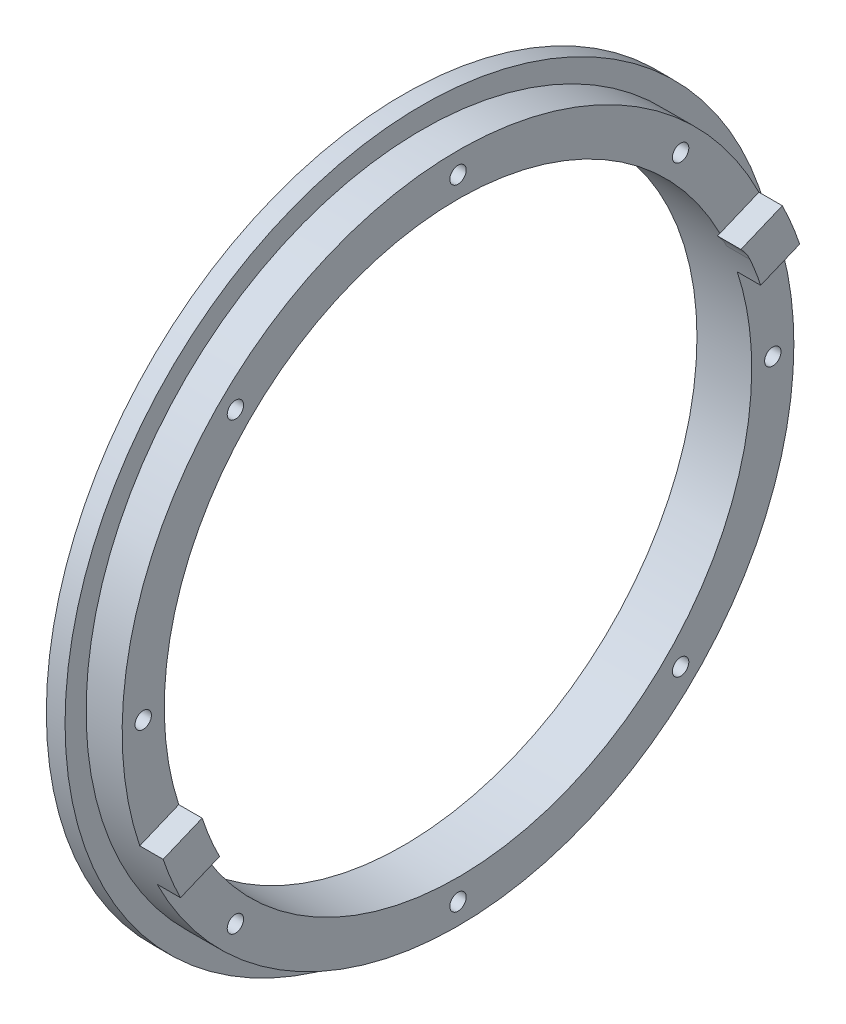
ISO-10303-21;
HEADER;
FILE_DESCRIPTION(('STEP AP214'),'2;1');
FILE_NAME('part.step','',(''),(''),'','','');
FILE_SCHEMA(('AUTOMOTIVE_DESIGN { 1 0 10303 214 1 1 1 1 }'));
ENDSEC;
DATA;
#1=APPLICATION_CONTEXT('core data for automotive mechanical design processes');
#2=APPLICATION_PROTOCOL_DEFINITION('international standard','automotive_design',2000,#1);
#3=PRODUCT_CONTEXT('',#1,'mechanical');
#4=PRODUCT('Part','Part','',(#3));
#5=PRODUCT_RELATED_PRODUCT_CATEGORY('part','',(#4));
#6=PRODUCT_DEFINITION_FORMATION('','',#4);
#7=PRODUCT_DEFINITION_CONTEXT('part definition',#1,'design');
#8=PRODUCT_DEFINITION('design','',#6,#7);
#9=PRODUCT_DEFINITION_SHAPE('','',#8);
#10=(LENGTH_UNIT() NAMED_UNIT(*) SI_UNIT(.MILLI.,.METRE.));
#11=(NAMED_UNIT(*) PLANE_ANGLE_UNIT() SI_UNIT($,.RADIAN.));
#12=(NAMED_UNIT(*) SI_UNIT($,.STERADIAN.) SOLID_ANGLE_UNIT());
#13=UNCERTAINTY_MEASURE_WITH_UNIT(LENGTH_MEASURE(1.E-05),#10,'distance_accuracy_value','');
#14=(GEOMETRIC_REPRESENTATION_CONTEXT(3) GLOBAL_UNCERTAINTY_ASSIGNED_CONTEXT((#13)) GLOBAL_UNIT_ASSIGNED_CONTEXT((#10,
#11,#12)) REPRESENTATION_CONTEXT('',''));
#15=CARTESIAN_POINT('',(0.,0.,0.));
#16=DIRECTION('',(0.,0.,1.));
#17=DIRECTION('',(1.,0.,0.));
#18=AXIS2_PLACEMENT_3D('',#15,#16,#17);
#19=CARTESIAN_POINT('',(-30.3,62.75,0.));
#20=DIRECTION('',(1.,0.,0.));
#21=DIRECTION('',(0.,0.,-1.));
#22=AXIS2_PLACEMENT_3D('',#19,#20,#21);
#23=PLANE('',#22);
#24=DIRECTION('',(0.,-0.382683432364652,0.923879532511468));
#25=VECTOR('',#24,1.);
#26=CARTESIAN_POINT('',(-30.3,22.9139193047166,-67.9927555118701));
#27=LINE('',#26,#25);
#28=CARTESIAN_POINT('',(-30.3,22.9139193047166,-67.9927555118701));
#29=VERTEX_POINT('',#28);
#30=CARTESIAN_POINT('',(-30.3,19.4607357434147,-59.6560329248));
#31=VERTEX_POINT('',#30);
#32=EDGE_CURVE('E147',#29,#31,#27,.T.);
#33=ORIENTED_EDGE('',*,*,#32,.F.);
#34=CARTESIAN_POINT('',(-30.3,0.,0.));
#35=DIRECTION('',(1.,0.,0.));
#36=DIRECTION('',(0.,0.,-1.));
#37=AXIS2_PLACEMENT_3D('',#34,#35,#36);
#38=CIRCLE('',#37,71.75);
#39=CARTESIAN_POINT('',(-30.3,31.875550770089,-64.2807262179283));
#40=VERTEX_POINT('',#39);
#41=EDGE_CURVE('E43',#29,#40,#38,.T.);
#42=ORIENTED_EDGE('',*,*,#41,.T.);
#43=DIRECTION('',(0.,0.382683432366034,-0.923879532510895));
#44=VECTOR('',#43,1.);
#45=CARTESIAN_POINT('',(-30.3,28.4223672087732,-55.94400363086));
#46=LINE('',#45,#44);
#47=CARTESIAN_POINT('',(-30.3,28.21016806619,-55.43170958291));
#48=VERTEX_POINT('',#47);
#49=EDGE_CURVE('E158',#48,#40,#46,.T.);
#50=ORIENTED_EDGE('',*,*,#49,.F.);
#51=CARTESIAN_POINT('',(-30.3,21.5977855693646,-48.8921073231567));
#52=DIRECTION('',(-1.,0.,0.));
#53=DIRECTION('',(0.,0.,1.));
#54=AXIS2_PLACEMENT_3D('',#51,#52,#53);
#55=CIRCLE('',#54,9.30000000000502);
#56=CARTESIAN_POINT('',(-30.3,25.3556790360666,-57.3990595795769));
#57=VERTEX_POINT('',#56);
#58=EDGE_CURVE('E130',#48,#57,#55,.T.);
#59=ORIENTED_EDGE('',*,*,#58,.T.);
#60=CARTESIAN_POINT('',(-30.3,0.,0.));
#61=DIRECTION('',(1.,0.,0.));
#62=DIRECTION('',(0.,0.,-1.));
#63=AXIS2_PLACEMENT_3D('',#60,#61,#62);
#64=CIRCLE('',#63,62.75);
#65=EDGE_CURVE('E137',#31,#57,#64,.T.);
#66=ORIENTED_EDGE('',*,*,#65,.F.);
#67=EDGE_LOOP('',(#33,#42,#50,#59,#66));
#68=FACE_BOUND('',#67,.T.);
#69=ADVANCED_FACE('F34',(#68),#23,.T.);
#70=DIRECTION('',(0.,-0.382683432365399,0.923879532511159));
#71=VECTOR('',#70,1.);
#72=CARTESIAN_POINT('',(-30.3,-28.42236720877,55.94400363086));
#73=LINE('',#72,#71);
#74=CARTESIAN_POINT('',(-30.3,-28.42236720877,55.94400363086));
#75=VERTEX_POINT('',#74);
#76=CARTESIAN_POINT('',(-30.3,-31.8755507700787,64.2807262179274));
#77=VERTEX_POINT('',#76);
#78=EDGE_CURVE('E139',#75,#77,#73,.T.);
#79=ORIENTED_EDGE('',*,*,#78,.F.);
#80=CARTESIAN_POINT('',(-30.3,-19.4607357434007,59.6560329248));
#81=VERTEX_POINT('',#80);
#82=EDGE_CURVE('E185',#81,#75,#64,.T.);
#83=ORIENTED_EDGE('',*,*,#82,.F.);
#84=DIRECTION('',(0.,0.382683432365862,-0.923879532510967));
#85=VECTOR('',#84,1.);
#86=CARTESIAN_POINT('',(-30.3,-22.9139193047154,67.99275551187));
#87=LINE('',#86,#85);
#88=CARTESIAN_POINT('',(-30.3,-22.9139193047154,67.99275551187));
#89=VERTEX_POINT('',#88);
#90=EDGE_CURVE('E168',#89,#81,#87,.T.);
#91=ORIENTED_EDGE('',*,*,#90,.F.);
#92=EDGE_CURVE('E11',#89,#77,#38,.T.);
#93=ORIENTED_EDGE('',*,*,#92,.T.);
#94=EDGE_LOOP('',(#79,#83,#91,#93));
#95=FACE_BOUND('',#94,.T.);
#96=ADVANCED_FACE('F36',(#95),#23,.T.);
#97=CARTESIAN_POINT('',(-47.,0.,0.));
#98=DIRECTION('',(1.,0.,0.));
#99=DIRECTION('',(0.,0.,-1.));
#100=AXIS2_PLACEMENT_3D('',#97,#98,#99);
#101=CYLINDRICAL_SURFACE('',#100,71.75);
#102=DIRECTION('',(1.,0.,0.));
#103=VECTOR('',#102,1.);
#104=CARTESIAN_POINT('',(-35.3,22.9139193047166,-67.9927555118701));
#105=LINE('',#104,#103);
#106=CARTESIAN_POINT('',(-35.3,22.9139193047166,-67.9927555118701));
#107=VERTEX_POINT('',#106);
#108=EDGE_CURVE('E159',#107,#29,#105,.T.);
#109=ORIENTED_EDGE('',*,*,#108,.F.);
#110=CARTESIAN_POINT('',(-35.3,0.,0.));
#111=DIRECTION('',(1.,0.,0.));
#112=DIRECTION('',(0.,0.,-1.));
#113=AXIS2_PLACEMENT_3D('',#110,#111,#112);
#114=CIRCLE('',#113,71.75);
#115=CARTESIAN_POINT('',(-35.3,-31.8755507700787,64.2807262179274));
#116=VERTEX_POINT('',#115);
#117=EDGE_CURVE('E150',#116,#107,#114,.T.);
#118=ORIENTED_EDGE('',*,*,#117,.F.);
#119=DIRECTION('',(1.,0.,0.));
#120=VECTOR('',#119,1.);
#121=CARTESIAN_POINT('',(-35.3,-31.8755507700787,64.2807262179274));
#122=LINE('',#121,#120);
#123=EDGE_CURVE('E161',#116,#77,#122,.T.);
#124=ORIENTED_EDGE('',*,*,#123,.T.);
#125=ORIENTED_EDGE('',*,*,#92,.F.);
#126=DIRECTION('',(1.,0.,0.));
#127=VECTOR('',#126,1.);
#128=CARTESIAN_POINT('',(-35.3,-22.9139193047154,67.99275551187));
#129=LINE('',#128,#127);
#130=CARTESIAN_POINT('',(-35.3,-22.9139193047154,67.99275551187));
#131=VERTEX_POINT('',#130);
#132=EDGE_CURVE('E181',#131,#89,#129,.T.);
#133=ORIENTED_EDGE('',*,*,#132,.F.);
#134=CARTESIAN_POINT('',(-35.3,1.32185928869433E-12,-2.60208521396521E-12));
#135=DIRECTION('',(1.,0.,0.));
#136=DIRECTION('',(0.,0.,-1.));
#137=AXIS2_PLACEMENT_3D('',#134,#135,#136);
#138=CIRCLE('',#137,71.7500000000025);
#139=CARTESIAN_POINT('',(-35.3,31.875550770089,-64.2807262179283));
#140=VERTEX_POINT('',#139);
#141=EDGE_CURVE('E171',#140,#131,#138,.T.);
#142=ORIENTED_EDGE('',*,*,#141,.F.);
#143=DIRECTION('',(1.,0.,0.));
#144=VECTOR('',#143,1.);
#145=CARTESIAN_POINT('',(-35.3,31.875550770089,-64.2807262179283));
#146=LINE('',#145,#144);
#147=EDGE_CURVE('E174',#140,#40,#146,.T.);
#148=ORIENTED_EDGE('',*,*,#147,.T.);
#149=ORIENTED_EDGE('',*,*,#41,.F.);
#150=EDGE_LOOP('',(#109,#118,#124,#125,#133,#142,#148,#149));
#151=FACE_BOUND('',#150,.T.);
#152=CARTESIAN_POINT('',(-43.,0.,0.));
#153=DIRECTION('',(1.,0.,0.));
#154=DIRECTION('',(0.,0.,-1.));
#155=AXIS2_PLACEMENT_3D('',#152,#153,#154);
#156=CIRCLE('',#155,71.75);
#157=CARTESIAN_POINT('',(-43.,0.,-71.75));
#158=VERTEX_POINT('',#157);
#159=EDGE_CURVE('E197',#158,#158,#156,.T.);
#160=ORIENTED_EDGE('',*,*,#159,.T.);
#161=EDGE_LOOP('',(#160));
#162=FACE_BOUND('',#161,.T.);
#163=ADVANCED_FACE('F304',(#151,#162),#101,.T.);
#164=CARTESIAN_POINT('',(-43.,71.75,0.));
#165=DIRECTION('',(1.,0.,0.));
#166=DIRECTION('',(0.,0.,-1.));
#167=AXIS2_PLACEMENT_3D('',#164,#165,#166);
#168=PLANE('',#167);
#169=CARTESIAN_POINT('',(-43.,0.,0.));
#170=DIRECTION('',(1.,0.,0.));
#171=DIRECTION('',(0.,0.,-1.));
#172=AXIS2_PLACEMENT_3D('',#169,#170,#171);
#173=CIRCLE('',#172,76.25);
#174=CARTESIAN_POINT('',(-43.,0.,-76.25));
#175=VERTEX_POINT('',#174);
#176=EDGE_CURVE('E194',#175,#175,#173,.T.);
#177=ORIENTED_EDGE('',*,*,#176,.T.);
#178=EDGE_LOOP('',(#177));
#179=FACE_BOUND('',#178,.T.);
#180=ORIENTED_EDGE('',*,*,#159,.F.);
#181=EDGE_LOOP('',(#180));
#182=FACE_BOUND('',#181,.T.);
#183=ADVANCED_FACE('F329',(#179,#182),#168,.T.);
#184=CARTESIAN_POINT('',(-47.,0.,0.));
#185=DIRECTION('',(1.,0.,0.));
#186=DIRECTION('',(0.,0.,-1.));
#187=AXIS2_PLACEMENT_3D('',#184,#185,#186);
#188=CYLINDRICAL_SURFACE('',#187,76.25);
#189=CARTESIAN_POINT('',(-47.,0.,0.));
#190=DIRECTION('',(1.,0.,0.));
#191=DIRECTION('',(0.,0.,-1.));
#192=AXIS2_PLACEMENT_3D('',#189,#190,#191);
#193=CIRCLE('',#192,76.25);
#194=CARTESIAN_POINT('',(-47.,0.,-76.25));
#195=VERTEX_POINT('',#194);
#196=EDGE_CURVE('E191',#195,#195,#193,.T.);
#197=ORIENTED_EDGE('',*,*,#196,.T.);
#198=EDGE_LOOP('',(#197));
#199=FACE_BOUND('',#198,.T.);
#200=ORIENTED_EDGE('',*,*,#176,.F.);
#201=EDGE_LOOP('',(#200));
#202=FACE_BOUND('',#201,.T.);
#203=ADVANCED_FACE('F333',(#199,#202),#188,.T.);
#204=CARTESIAN_POINT('',(-47.,76.25,0.));
#205=DIRECTION('',(-1.,0.,0.));
#206=DIRECTION('',(0.,0.,1.));
#207=AXIS2_PLACEMENT_3D('',#204,#205,#206);
#208=PLANE('',#207);
#209=CARTESIAN_POINT('',(-47.,-47.5529310348,-47.5529310348));
#210=DIRECTION('',(-1.,0.,0.));
#211=DIRECTION('',(0.,0.,1.));
#212=AXIS2_PLACEMENT_3D('',#209,#210,#211);
#213=CIRCLE('',#212,3.25000000000002);
#214=CARTESIAN_POINT('',(-47.,-47.5529310348,-44.3029310348));
#215=VERTEX_POINT('',#214);
#216=EDGE_CURVE('E347',#215,#215,#213,.T.);
#217=ORIENTED_EDGE('',*,*,#216,.F.);
#218=EDGE_LOOP('',(#217));
#219=FACE_BOUND('',#218,.T.);
#220=CARTESIAN_POINT('',(-47.,-67.25,0.));
#221=DIRECTION('',(-1.,0.,0.));
#222=DIRECTION('',(0.,0.,1.));
#223=AXIS2_PLACEMENT_3D('',#220,#221,#222);
#224=CIRCLE('',#223,3.25000000000002);
#225=CARTESIAN_POINT('',(-47.,-67.25,3.25000000000002));
#226=VERTEX_POINT('',#225);
#227=EDGE_CURVE('E243',#226,#226,#224,.T.);
#228=ORIENTED_EDGE('',*,*,#227,.F.);
#229=EDGE_LOOP('',(#228));
#230=FACE_BOUND('',#229,.T.);
#231=CARTESIAN_POINT('',(-47.,-47.5529310348,47.5529310348));
#232=DIRECTION('',(-1.,0.,0.));
#233=DIRECTION('',(0.,0.,1.));
#234=AXIS2_PLACEMENT_3D('',#231,#232,#233);
#235=CIRCLE('',#234,3.25000000000002);
#236=CARTESIAN_POINT('',(-47.,-47.5529310348,50.8029310348));
#237=VERTEX_POINT('',#236);
#238=EDGE_CURVE('E230',#237,#237,#235,.T.);
#239=ORIENTED_EDGE('',*,*,#238,.F.);
#240=EDGE_LOOP('',(#239));
#241=FACE_BOUND('',#240,.T.);
#242=CARTESIAN_POINT('',(-47.,0.,67.25));
#243=DIRECTION('',(-1.,0.,0.));
#244=DIRECTION('',(0.,0.,1.));
#245=AXIS2_PLACEMENT_3D('',#242,#243,#244);
#246=CIRCLE('',#245,3.25000000000001);
#247=CARTESIAN_POINT('',(-47.,0.,70.5));
#248=VERTEX_POINT('',#247);
#249=EDGE_CURVE('E226',#248,#248,#246,.T.);
#250=ORIENTED_EDGE('',*,*,#249,.F.);
#251=EDGE_LOOP('',(#250));
#252=FACE_BOUND('',#251,.T.);
#253=CARTESIAN_POINT('',(-47.,47.5529310348,47.5529310348));
#254=DIRECTION('',(-1.,0.,0.));
#255=DIRECTION('',(0.,0.,1.));
#256=AXIS2_PLACEMENT_3D('',#253,#254,#255);
#257=CIRCLE('',#256,3.25000000000002);
#258=CARTESIAN_POINT('',(-47.,47.5529310348,50.8029310348));
#259=VERTEX_POINT('',#258);
#260=EDGE_CURVE('E222',#259,#259,#257,.T.);
#261=ORIENTED_EDGE('',*,*,#260,.F.);
#262=EDGE_LOOP('',(#261));
#263=FACE_BOUND('',#262,.T.);
#264=CARTESIAN_POINT('',(-47.,67.25,0.));
#265=DIRECTION('',(-1.,0.,0.));
#266=DIRECTION('',(0.,0.,1.));
#267=AXIS2_PLACEMENT_3D('',#264,#265,#266);
#268=CIRCLE('',#267,3.25000000000002);
#269=CARTESIAN_POINT('',(-47.,67.25,3.25000000000002));
#270=VERTEX_POINT('',#269);
#271=EDGE_CURVE('E217',#270,#270,#268,.T.);
#272=ORIENTED_EDGE('',*,*,#271,.F.);
#273=EDGE_LOOP('',(#272));
#274=FACE_BOUND('',#273,.T.);
#275=CARTESIAN_POINT('',(-47.,47.5529310348,-47.5529310348));
#276=DIRECTION('',(-1.,0.,0.));
#277=DIRECTION('',(0.,0.,1.));
#278=AXIS2_PLACEMENT_3D('',#275,#276,#277);
#279=CIRCLE('',#278,3.25000000000002);
#280=CARTESIAN_POINT('',(-47.,47.5529310348,-44.3029310348));
#281=VERTEX_POINT('',#280);
#282=EDGE_CURVE('E212',#281,#281,#279,.T.);
#283=ORIENTED_EDGE('',*,*,#282,.F.);
#284=EDGE_LOOP('',(#283));
#285=FACE_BOUND('',#284,.T.);
#286=CARTESIAN_POINT('',(-47.,0.,-67.25));
#287=DIRECTION('',(-1.,0.,0.));
#288=DIRECTION('',(0.,0.,1.));
#289=AXIS2_PLACEMENT_3D('',#286,#287,#288);
#290=CIRCLE('',#289,3.25000000000001);
#291=CARTESIAN_POINT('',(-47.,0.,-64.));
#292=VERTEX_POINT('',#291);
#293=EDGE_CURVE('E207',#292,#292,#290,.T.);
#294=ORIENTED_EDGE('',*,*,#293,.F.);
#295=EDGE_LOOP('',(#294));
#296=FACE_BOUND('',#295,.T.);
#297=CARTESIAN_POINT('',(-47.,0.,0.));
#298=DIRECTION('',(1.,0.,0.));
#299=DIRECTION('',(0.,0.,-1.));
#300=AXIS2_PLACEMENT_3D('',#297,#298,#299);
#301=CIRCLE('',#300,62.75);
#302=CARTESIAN_POINT('',(-47.,0.,-62.75));
#303=VERTEX_POINT('',#302);
#304=EDGE_CURVE('E188',#303,#303,#301,.T.);
#305=ORIENTED_EDGE('',*,*,#304,.T.);
#306=EDGE_LOOP('',(#305));
#307=FACE_BOUND('',#306,.T.);
#308=ORIENTED_EDGE('',*,*,#196,.F.);
#309=EDGE_LOOP('',(#308));
#310=FACE_BOUND('',#309,.T.);
#311=ADVANCED_FACE('F319',(#219,#230,#241,#252,#263,#274,#285,#296,#307,#310),#208,.T.);
#312=CARTESIAN_POINT('',(-47.,0.,0.));
#313=DIRECTION('',(1.,0.,0.));
#314=DIRECTION('',(0.,0.,-1.));
#315=AXIS2_PLACEMENT_3D('',#312,#313,#314);
#316=CYLINDRICAL_SURFACE('',#315,62.75);
#317=DIRECTION('',(1.,0.,0.));
#318=VECTOR('',#317,1.);
#319=CARTESIAN_POINT('',(-35.3,25.3556790360666,-57.3990595795769));
#320=LINE('',#319,#318);
#321=CARTESIAN_POINT('',(-35.3,25.3556790360666,-57.3990595795769));
#322=VERTEX_POINT('',#321);
#323=EDGE_CURVE('E126',#322,#57,#320,.T.);
#324=ORIENTED_EDGE('',*,*,#323,.F.);
#325=CARTESIAN_POINT('',(-35.3,0.,0.));
#326=DIRECTION('',(1.,0.,0.));
#327=DIRECTION('',(0.,0.,-1.));
#328=AXIS2_PLACEMENT_3D('',#325,#326,#327);
#329=CIRCLE('',#328,62.7499999999987);
#330=CARTESIAN_POINT('',(-35.3,28.42236720877,-55.94400363086));
#331=VERTEX_POINT('',#330);
#332=EDGE_CURVE('E112',#322,#331,#329,.T.);
#333=ORIENTED_EDGE('',*,*,#332,.T.);
#334=CARTESIAN_POINT('',(-35.3,1.32185928869433E-12,-2.60208521396521E-12));
#335=DIRECTION('',(-1.,0.,0.));
#336=DIRECTION('',(0.,0.,1.));
#337=AXIS2_PLACEMENT_3D('',#334,#335,#336);
#338=CIRCLE('',#337,62.7499999999973);
#339=CARTESIAN_POINT('',(-35.3,-19.4607357434024,59.6560329248053));
#340=VERTEX_POINT('',#339);
#341=EDGE_CURVE('E165',#340,#331,#338,.T.);
#342=ORIENTED_EDGE('',*,*,#341,.F.);
#343=DIRECTION('',(1.,0.,0.));
#344=VECTOR('',#343,1.);
#345=CARTESIAN_POINT('',(-35.3,-19.4607357434007,59.6560329248));
#346=LINE('',#345,#344);
#347=EDGE_CURVE('E178',#340,#81,#346,.T.);
#348=ORIENTED_EDGE('',*,*,#347,.T.);
#349=ORIENTED_EDGE('',*,*,#82,.T.);
#350=DIRECTION('',(1.,0.,0.));
#351=VECTOR('',#350,1.);
#352=CARTESIAN_POINT('',(-35.3,-28.42236720877,55.94400363086));
#353=LINE('',#352,#351);
#354=CARTESIAN_POINT('',(-35.3,-28.42236720877,55.94400363086));
#355=VERTEX_POINT('',#354);
#356=EDGE_CURVE('E153',#355,#75,#353,.T.);
#357=ORIENTED_EDGE('',*,*,#356,.F.);
#358=CARTESIAN_POINT('',(-35.3,0.,0.));
#359=DIRECTION('',(-1.,0.,0.));
#360=DIRECTION('',(0.,0.,1.));
#361=AXIS2_PLACEMENT_3D('',#358,#359,#360);
#362=CIRCLE('',#361,62.7499999999987);
#363=CARTESIAN_POINT('',(-35.3,19.4607357434151,-59.6560329248012));
#364=VERTEX_POINT('',#363);
#365=EDGE_CURVE('E144',#364,#355,#362,.T.);
#366=ORIENTED_EDGE('',*,*,#365,.F.);
#367=DIRECTION('',(1.,0.,0.));
#368=VECTOR('',#367,1.);
#369=CARTESIAN_POINT('',(-35.3,19.4607357434147,-59.6560329248));
#370=LINE('',#369,#368);
#371=EDGE_CURVE('E156',#364,#31,#370,.T.);
#372=ORIENTED_EDGE('',*,*,#371,.T.);
#373=ORIENTED_EDGE('',*,*,#65,.T.);
#374=EDGE_LOOP('',(#324,#333,#342,#348,#349,#357,#366,#372,#373));
#375=FACE_BOUND('',#374,.T.);
#376=ORIENTED_EDGE('',*,*,#304,.F.);
#377=EDGE_LOOP('',(#376));
#378=FACE_BOUND('',#377,.T.);
#379=ADVANCED_FACE('F133',(#375,#378),#316,.F.);
#380=CARTESIAN_POINT('',(-35.3,-22.9139193047154,67.99275551187));
#381=DIRECTION('',(0.,-0.923879532510967,-0.382683432365862));
#382=DIRECTION('',(0.,0.382683432365862,-0.923879532510967));
#383=AXIS2_PLACEMENT_3D('',#380,#381,#382);
#384=PLANE('',#383);
#385=ORIENTED_EDGE('',*,*,#90,.T.);
#386=ORIENTED_EDGE('',*,*,#347,.F.);
#387=DIRECTION('',(0.,0.382683432365862,-0.923879532510967));
#388=VECTOR('',#387,1.);
#389=CARTESIAN_POINT('',(-35.3,-22.9139193047154,67.99275551187));
#390=LINE('',#389,#388);
#391=EDGE_CURVE('E59',#131,#340,#390,.T.);
#392=ORIENTED_EDGE('',*,*,#391,.F.);
#393=ORIENTED_EDGE('',*,*,#132,.T.);
#394=EDGE_LOOP('',(#385,#386,#392,#393));
#395=FACE_BOUND('',#394,.T.);
#396=ADVANCED_FACE('F311',(#395),#384,.F.);
#397=CARTESIAN_POINT('',(-35.3,28.4223672087732,-55.94400363086));
#398=DIRECTION('',(0.,-0.923879532510895,-0.382683432366034));
#399=DIRECTION('',(0.,0.382683432366034,-0.923879532510896));
#400=AXIS2_PLACEMENT_3D('',#397,#398,#399);
#401=PLANE('',#400);
#402=ORIENTED_EDGE('',*,*,#49,.T.);
#403=ORIENTED_EDGE('',*,*,#147,.F.);
#404=DIRECTION('',(0.,0.382683432366034,-0.923879532510895));
#405=VECTOR('',#404,1.);
#406=CARTESIAN_POINT('',(-35.3,28.4223672087732,-55.94400363086));
#407=LINE('',#406,#405);
#408=EDGE_CURVE('E167',#331,#140,#407,.T.);
#409=ORIENTED_EDGE('',*,*,#408,.F.);
#410=DIRECTION('',(0.,-0.382683432359075,0.923879532513778));
#411=VECTOR('',#410,1.);
#412=CARTESIAN_POINT('',(-35.3,28.42236720877,-55.94400363086));
#413=LINE('',#412,#411);
#414=CARTESIAN_POINT('',(-35.3,28.21016806619,-55.43170958291));
#415=VERTEX_POINT('',#414);
#416=EDGE_CURVE('E117',#331,#415,#413,.T.);
#417=ORIENTED_EDGE('',*,*,#416,.T.);
#418=DIRECTION('',(1.,0.,0.));
#419=VECTOR('',#418,1.);
#420=CARTESIAN_POINT('',(-35.3,28.21016806619,-55.43170958291));
#421=LINE('',#420,#419);
#422=EDGE_CURVE('E129',#415,#48,#421,.T.);
#423=ORIENTED_EDGE('',*,*,#422,.T.);
#424=EDGE_LOOP('',(#402,#403,#409,#417,#423));
#425=FACE_BOUND('',#424,.T.);
#426=ADVANCED_FACE('F289',(#425),#401,.F.);
#427=CARTESIAN_POINT('',(-35.3,1.32185928869433E-12,-2.60208521396521E-12));
#428=DIRECTION('',(-1.,0.,0.));
#429=DIRECTION('',(0.,0.,1.));
#430=AXIS2_PLACEMENT_3D('',#427,#428,#429);
#431=PLANE('',#430);
#432=CARTESIAN_POINT('',(-35.3,0.,67.25));
#433=DIRECTION('',(-1.,0.,0.));
#434=DIRECTION('',(0.,0.,1.));
#435=AXIS2_PLACEMENT_3D('',#432,#433,#434);
#436=CIRCLE('',#435,1.75000000000001);
#437=CARTESIAN_POINT('',(-35.3,0.,69.));
#438=VERTEX_POINT('',#437);
#439=EDGE_CURVE('E219',#438,#438,#436,.T.);
#440=ORIENTED_EDGE('',*,*,#439,.T.);
#441=EDGE_LOOP('',(#440));
#442=FACE_BOUND('',#441,.T.);
#443=CARTESIAN_POINT('',(-35.3,47.5529310348,47.5529310348));
#444=DIRECTION('',(-1.,0.,0.));
#445=DIRECTION('',(0.,0.,1.));
#446=AXIS2_PLACEMENT_3D('',#443,#444,#445);
#447=CIRCLE('',#446,1.75000000000002);
#448=CARTESIAN_POINT('',(-35.3,47.5529310348,49.3029310348));
#449=VERTEX_POINT('',#448);
#450=EDGE_CURVE('E214',#449,#449,#447,.T.);
#451=ORIENTED_EDGE('',*,*,#450,.T.);
#452=EDGE_LOOP('',(#451));
#453=FACE_BOUND('',#452,.T.);
#454=CARTESIAN_POINT('',(-35.3,67.25,0.));
#455=DIRECTION('',(-1.,0.,0.));
#456=DIRECTION('',(0.,0.,1.));
#457=AXIS2_PLACEMENT_3D('',#454,#455,#456);
#458=CIRCLE('',#457,1.75000000000002);
#459=CARTESIAN_POINT('',(-35.3,67.25,1.75000000000002));
#460=VERTEX_POINT('',#459);
#461=EDGE_CURVE('E209',#460,#460,#458,.T.);
#462=ORIENTED_EDGE('',*,*,#461,.T.);
#463=EDGE_LOOP('',(#462));
#464=FACE_BOUND('',#463,.T.);
#465=CARTESIAN_POINT('',(-35.3,47.5529310348,-47.5529310348));
#466=DIRECTION('',(-1.,0.,0.));
#467=DIRECTION('',(0.,0.,1.));
#468=AXIS2_PLACEMENT_3D('',#465,#466,#467);
#469=CIRCLE('',#468,1.75000000000002);
#470=CARTESIAN_POINT('',(-35.3,47.5529310348,-45.8029310348));
#471=VERTEX_POINT('',#470);
#472=EDGE_CURVE('E204',#471,#471,#469,.T.);
#473=ORIENTED_EDGE('',*,*,#472,.T.);
#474=EDGE_LOOP('',(#473));
#475=FACE_BOUND('',#474,.T.);
#476=ORIENTED_EDGE('',*,*,#341,.T.);
#477=ORIENTED_EDGE('',*,*,#408,.T.);
#478=ORIENTED_EDGE('',*,*,#141,.T.);
#479=ORIENTED_EDGE('',*,*,#391,.T.);
#480=EDGE_LOOP('',(#476,#477,#478,#479));
#481=FACE_BOUND('',#480,.T.);
#482=ADVANCED_FACE('F291',(#442,#453,#464,#475,#481),#431,.F.);
#483=CARTESIAN_POINT('',(-35.3,22.9139193047166,-67.9927555118701));
#484=DIRECTION('',(0.,0.923879532511468,0.382683432364652));
#485=DIRECTION('',(0.,-0.382683432364652,0.923879532511468));
#486=AXIS2_PLACEMENT_3D('',#483,#484,#485);
#487=PLANE('',#486);
#488=ORIENTED_EDGE('',*,*,#32,.T.);
#489=ORIENTED_EDGE('',*,*,#371,.F.);
#490=DIRECTION('',(0.,-0.382683432364652,0.923879532511468));
#491=VECTOR('',#490,1.);
#492=CARTESIAN_POINT('',(-35.3,22.9139193047166,-67.9927555118701));
#493=LINE('',#492,#491);
#494=EDGE_CURVE('E51',#107,#364,#493,.T.);
#495=ORIENTED_EDGE('',*,*,#494,.F.);
#496=ORIENTED_EDGE('',*,*,#108,.T.);
#497=EDGE_LOOP('',(#488,#489,#495,#496));
#498=FACE_BOUND('',#497,.T.);
#499=ADVANCED_FACE('F309',(#498),#487,.F.);
#500=CARTESIAN_POINT('',(-35.3,-28.42236720877,55.94400363086));
#501=DIRECTION('',(0.,0.923879532511159,0.382683432365399));
#502=DIRECTION('',(0.,-0.382683432365399,0.923879532511159));
#503=AXIS2_PLACEMENT_3D('',#500,#501,#502);
#504=PLANE('',#503);
#505=ORIENTED_EDGE('',*,*,#78,.T.);
#506=ORIENTED_EDGE('',*,*,#123,.F.);
#507=DIRECTION('',(0.,-0.382683432365399,0.923879532511159));
#508=VECTOR('',#507,1.);
#509=CARTESIAN_POINT('',(-35.3,-28.42236720877,55.94400363086));
#510=LINE('',#509,#508);
#511=EDGE_CURVE('E146',#355,#116,#510,.T.);
#512=ORIENTED_EDGE('',*,*,#511,.F.);
#513=ORIENTED_EDGE('',*,*,#356,.T.);
#514=EDGE_LOOP('',(#505,#506,#512,#513));
#515=FACE_BOUND('',#514,.T.);
#516=ADVANCED_FACE('F300',(#515),#504,.F.);
#517=CARTESIAN_POINT('',(-35.3,0.,0.));
#518=DIRECTION('',(-1.,0.,0.));
#519=DIRECTION('',(0.,0.,1.));
#520=AXIS2_PLACEMENT_3D('',#517,#518,#519);
#521=PLANE('',#520);
#522=CARTESIAN_POINT('',(-35.3,-47.5529310348,-47.5529310348));
#523=DIRECTION('',(-1.,0.,0.));
#524=DIRECTION('',(0.,0.,1.));
#525=AXIS2_PLACEMENT_3D('',#522,#523,#524);
#526=CIRCLE('',#525,1.75000000000002);
#527=CARTESIAN_POINT('',(-35.3,-47.5529310348,-45.8029310348));
#528=VERTEX_POINT('',#527);
#529=EDGE_CURVE('E38',#528,#528,#526,.T.);
#530=ORIENTED_EDGE('',*,*,#529,.T.);
#531=EDGE_LOOP('',(#530));
#532=FACE_BOUND('',#531,.T.);
#533=CARTESIAN_POINT('',(-35.3,-67.25,0.));
#534=DIRECTION('',(-1.,0.,0.));
#535=DIRECTION('',(0.,0.,1.));
#536=AXIS2_PLACEMENT_3D('',#533,#534,#535);
#537=CIRCLE('',#536,1.75000000000002);
#538=CARTESIAN_POINT('',(-35.3,-67.25,1.75000000000002));
#539=VERTEX_POINT('',#538);
#540=EDGE_CURVE('E228',#539,#539,#537,.T.);
#541=ORIENTED_EDGE('',*,*,#540,.T.);
#542=EDGE_LOOP('',(#541));
#543=FACE_BOUND('',#542,.T.);
#544=CARTESIAN_POINT('',(-35.3,-47.5529310348,47.5529310348));
#545=DIRECTION('',(-1.,0.,0.));
#546=DIRECTION('',(0.,0.,1.));
#547=AXIS2_PLACEMENT_3D('',#544,#545,#546);
#548=CIRCLE('',#547,1.75000000000002);
#549=CARTESIAN_POINT('',(-35.3,-47.5529310348,49.3029310348));
#550=VERTEX_POINT('',#549);
#551=EDGE_CURVE('E224',#550,#550,#548,.T.);
#552=ORIENTED_EDGE('',*,*,#551,.T.);
#553=EDGE_LOOP('',(#552));
#554=FACE_BOUND('',#553,.T.);
#555=CARTESIAN_POINT('',(-35.3,0.,-67.25));
#556=DIRECTION('',(-1.,0.,0.));
#557=DIRECTION('',(0.,0.,1.));
#558=AXIS2_PLACEMENT_3D('',#555,#556,#557);
#559=CIRCLE('',#558,1.75000000000001);
#560=CARTESIAN_POINT('',(-35.3,0.,-65.5));
#561=VERTEX_POINT('',#560);
#562=EDGE_CURVE('E200',#561,#561,#559,.T.);
#563=ORIENTED_EDGE('',*,*,#562,.T.);
#564=EDGE_LOOP('',(#563));
#565=FACE_BOUND('',#564,.T.);
#566=ORIENTED_EDGE('',*,*,#365,.T.);
#567=ORIENTED_EDGE('',*,*,#511,.T.);
#568=ORIENTED_EDGE('',*,*,#117,.T.);
#569=ORIENTED_EDGE('',*,*,#494,.T.);
#570=EDGE_LOOP('',(#566,#567,#568,#569));
#571=FACE_BOUND('',#570,.T.);
#572=ADVANCED_FACE('F307',(#532,#543,#554,#565,#571),#521,.F.);
#573=CARTESIAN_POINT('',(-35.3,21.5977855693646,-48.8921073231567));
#574=DIRECTION('',(1.,0.,0.));
#575=DIRECTION('',(0.,0.,-1.));
#576=AXIS2_PLACEMENT_3D('',#573,#574,#575);
#577=CYLINDRICAL_SURFACE('',#576,9.30000000000502);
#578=ORIENTED_EDGE('',*,*,#58,.F.);
#579=ORIENTED_EDGE('',*,*,#422,.F.);
#580=CARTESIAN_POINT('',(-35.3,21.5977855693646,-48.8921073231567));
#581=DIRECTION('',(-1.,0.,0.));
#582=DIRECTION('',(0.,0.,1.));
#583=AXIS2_PLACEMENT_3D('',#580,#581,#582);
#584=CIRCLE('',#583,9.30000000000502);
#585=EDGE_CURVE('E115',#415,#322,#584,.T.);
#586=ORIENTED_EDGE('',*,*,#585,.T.);
#587=ORIENTED_EDGE('',*,*,#323,.T.);
#588=EDGE_LOOP('',(#578,#579,#586,#587));
#589=FACE_BOUND('',#588,.T.);
#590=ADVANCED_FACE('F125',(#589),#577,.F.);
#591=CARTESIAN_POINT('',(-35.3,21.5977855693646,-48.8921073231567));
#592=DIRECTION('',(-1.,0.,0.));
#593=DIRECTION('',(0.,0.,1.));
#594=AXIS2_PLACEMENT_3D('',#591,#592,#593);
#595=PLANE('',#594);
#596=ORIENTED_EDGE('',*,*,#585,.F.);
#597=ORIENTED_EDGE('',*,*,#416,.F.);
#598=ORIENTED_EDGE('',*,*,#332,.F.);
#599=EDGE_LOOP('',(#596,#597,#598));
#600=FACE_BOUND('',#599,.T.);
#601=ADVANCED_FACE('F114',(#600),#595,.T.);
#602=CARTESIAN_POINT('',(-47.,0.,-67.25));
#603=DIRECTION('',(-1.,0.,0.));
#604=DIRECTION('',(0.,0.,1.));
#605=AXIS2_PLACEMENT_3D('',#602,#603,#604);
#606=CYLINDRICAL_SURFACE('',#605,1.75000000000001);
#607=CARTESIAN_POINT('',(-45.,0.,-67.25));
#608=DIRECTION('',(-1.,0.,0.));
#609=DIRECTION('',(0.,0.,1.));
#610=AXIS2_PLACEMENT_3D('',#607,#608,#609);
#611=CIRCLE('',#610,1.75000000000002);
#612=CARTESIAN_POINT('',(-45.,0.,-65.5));
#613=VERTEX_POINT('',#612);
#614=EDGE_CURVE('E203',#613,#613,#611,.T.);
#615=ORIENTED_EDGE('',*,*,#614,.T.);
#616=EDGE_LOOP('',(#615));
#617=FACE_BOUND('',#616,.T.);
#618=ORIENTED_EDGE('',*,*,#562,.F.);
#619=EDGE_LOOP('',(#618));
#620=FACE_BOUND('',#619,.T.);
#621=ADVANCED_FACE('F384',(#617,#620),#606,.F.);
#622=CARTESIAN_POINT('',(-45.,1.75000000000002,-67.25));
#623=DIRECTION('',(1.,0.,0.));
#624=DIRECTION('',(0.,0.,-1.));
#625=AXIS2_PLACEMENT_3D('',#622,#623,#624);
#626=PLANE('',#625);
#627=ORIENTED_EDGE('',*,*,#614,.F.);
#628=EDGE_LOOP('',(#627));
#629=FACE_BOUND('',#628,.T.);
#630=CARTESIAN_POINT('',(-45.,0.,-67.25));
#631=DIRECTION('',(-1.,0.,0.));
#632=DIRECTION('',(0.,0.,1.));
#633=AXIS2_PLACEMENT_3D('',#630,#631,#632);
#634=CIRCLE('',#633,3.25000000000001);
#635=CARTESIAN_POINT('',(-45.,0.,-64.));
#636=VERTEX_POINT('',#635);
#637=EDGE_CURVE('E281',#636,#636,#634,.T.);
#638=ORIENTED_EDGE('',*,*,#637,.T.);
#639=EDGE_LOOP('',(#638));
#640=FACE_BOUND('',#639,.T.);
#641=ADVANCED_FACE('F374',(#629,#640),#626,.F.);
#642=CARTESIAN_POINT('',(-47.,0.,-67.25));
#643=DIRECTION('',(-1.,0.,0.));
#644=DIRECTION('',(0.,0.,1.));
#645=AXIS2_PLACEMENT_3D('',#642,#643,#644);
#646=CYLINDRICAL_SURFACE('',#645,3.25000000000001);
#647=ORIENTED_EDGE('',*,*,#637,.F.);
#648=EDGE_LOOP('',(#647));
#649=FACE_BOUND('',#648,.T.);
#650=ORIENTED_EDGE('',*,*,#293,.T.);
#651=EDGE_LOOP('',(#650));
#652=FACE_BOUND('',#651,.T.);
#653=ADVANCED_FACE('F371',(#649,#652),#646,.F.);
#654=CARTESIAN_POINT('',(-47.,47.5529310348,-47.5529310348));
#655=DIRECTION('',(-1.,0.,0.));
#656=DIRECTION('',(0.,0.,1.));
#657=AXIS2_PLACEMENT_3D('',#654,#655,#656);
#658=CYLINDRICAL_SURFACE('',#657,1.75000000000002);
#659=CARTESIAN_POINT('',(-45.,47.5529310348,-47.5529310348));
#660=DIRECTION('',(-1.,0.,0.));
#661=DIRECTION('',(0.,0.,1.));
#662=AXIS2_PLACEMENT_3D('',#659,#660,#661);
#663=CIRCLE('',#662,1.75000000000002);
#664=CARTESIAN_POINT('',(-45.,47.5529310348,-45.8029310348));
#665=VERTEX_POINT('',#664);
#666=EDGE_CURVE('E208',#665,#665,#663,.T.);
#667=ORIENTED_EDGE('',*,*,#666,.T.);
#668=EDGE_LOOP('',(#667));
#669=FACE_BOUND('',#668,.T.);
#670=ORIENTED_EDGE('',*,*,#472,.F.);
#671=EDGE_LOOP('',(#670));
#672=FACE_BOUND('',#671,.T.);
#673=ADVANCED_FACE('F373',(#669,#672),#658,.F.);
#674=CARTESIAN_POINT('',(-45.,49.3029310348,-47.5529310348));
#675=DIRECTION('',(1.,0.,0.));
#676=DIRECTION('',(0.,0.,-1.));
#677=AXIS2_PLACEMENT_3D('',#674,#675,#676);
#678=PLANE('',#677);
#679=ORIENTED_EDGE('',*,*,#666,.F.);
#680=EDGE_LOOP('',(#679));
#681=FACE_BOUND('',#680,.T.);
#682=CARTESIAN_POINT('',(-45.,47.5529310348,-47.5529310348));
#683=DIRECTION('',(-1.,0.,0.));
#684=DIRECTION('',(0.,0.,1.));
#685=AXIS2_PLACEMENT_3D('',#682,#683,#684);
#686=CIRCLE('',#685,3.25000000000002);
#687=CARTESIAN_POINT('',(-45.,47.5529310348,-44.3029310348));
#688=VERTEX_POINT('',#687);
#689=EDGE_CURVE('E274',#688,#688,#686,.T.);
#690=ORIENTED_EDGE('',*,*,#689,.T.);
#691=EDGE_LOOP('',(#690));
#692=FACE_BOUND('',#691,.T.);
#693=ADVANCED_FACE('F381',(#681,#692),#678,.F.);
#694=CARTESIAN_POINT('',(-47.,47.5529310348,-47.5529310348));
#695=DIRECTION('',(-1.,0.,0.));
#696=DIRECTION('',(0.,0.,1.));
#697=AXIS2_PLACEMENT_3D('',#694,#695,#696);
#698=CYLINDRICAL_SURFACE('',#697,3.25000000000002);
#699=ORIENTED_EDGE('',*,*,#689,.F.);
#700=EDGE_LOOP('',(#699));
#701=FACE_BOUND('',#700,.T.);
#702=ORIENTED_EDGE('',*,*,#282,.T.);
#703=EDGE_LOOP('',(#702));
#704=FACE_BOUND('',#703,.T.);
#705=ADVANCED_FACE('F419',(#701,#704),#698,.F.);
#706=CARTESIAN_POINT('',(-47.,67.25,0.));
#707=DIRECTION('',(-1.,0.,0.));
#708=DIRECTION('',(0.,0.,1.));
#709=AXIS2_PLACEMENT_3D('',#706,#707,#708);
#710=CYLINDRICAL_SURFACE('',#709,1.75000000000002);
#711=CARTESIAN_POINT('',(-45.,67.25,0.));
#712=DIRECTION('',(-1.,0.,0.));
#713=DIRECTION('',(0.,0.,1.));
#714=AXIS2_PLACEMENT_3D('',#711,#712,#713);
#715=CIRCLE('',#714,1.75000000000002);
#716=CARTESIAN_POINT('',(-45.,67.25,1.75000000000002));
#717=VERTEX_POINT('',#716);
#718=EDGE_CURVE('E213',#717,#717,#715,.T.);
#719=ORIENTED_EDGE('',*,*,#718,.T.);
#720=EDGE_LOOP('',(#719));
#721=FACE_BOUND('',#720,.T.);
#722=ORIENTED_EDGE('',*,*,#461,.F.);
#723=EDGE_LOOP('',(#722));
#724=FACE_BOUND('',#723,.T.);
#725=ADVANCED_FACE('F416',(#721,#724),#710,.F.);
#726=CARTESIAN_POINT('',(-45.,69.,0.));
#727=DIRECTION('',(1.,0.,0.));
#728=DIRECTION('',(0.,0.,-1.));
#729=AXIS2_PLACEMENT_3D('',#726,#727,#728);
#730=PLANE('',#729);
#731=ORIENTED_EDGE('',*,*,#718,.F.);
#732=EDGE_LOOP('',(#731));
#733=FACE_BOUND('',#732,.T.);
#734=CARTESIAN_POINT('',(-45.,67.25,0.));
#735=DIRECTION('',(-1.,0.,0.));
#736=DIRECTION('',(0.,0.,1.));
#737=AXIS2_PLACEMENT_3D('',#734,#735,#736);
#738=CIRCLE('',#737,3.25000000000002);
#739=CARTESIAN_POINT('',(-45.,67.25,3.25000000000002));
#740=VERTEX_POINT('',#739);
#741=EDGE_CURVE('E267',#740,#740,#738,.T.);
#742=ORIENTED_EDGE('',*,*,#741,.T.);
#743=EDGE_LOOP('',(#742));
#744=FACE_BOUND('',#743,.T.);
#745=ADVANCED_FACE('F418',(#733,#744),#730,.F.);
#746=CARTESIAN_POINT('',(-47.,67.25,0.));
#747=DIRECTION('',(-1.,0.,0.));
#748=DIRECTION('',(0.,0.,1.));
#749=AXIS2_PLACEMENT_3D('',#746,#747,#748);
#750=CYLINDRICAL_SURFACE('',#749,3.25000000000002);
#751=ORIENTED_EDGE('',*,*,#741,.F.);
#752=EDGE_LOOP('',(#751));
#753=FACE_BOUND('',#752,.T.);
#754=ORIENTED_EDGE('',*,*,#271,.T.);
#755=EDGE_LOOP('',(#754));
#756=FACE_BOUND('',#755,.T.);
#757=ADVANCED_FACE('F426',(#753,#756),#750,.F.);
#758=CARTESIAN_POINT('',(-47.,47.5529310348,47.5529310348));
#759=DIRECTION('',(-1.,0.,0.));
#760=DIRECTION('',(0.,0.,1.));
#761=AXIS2_PLACEMENT_3D('',#758,#759,#760);
#762=CYLINDRICAL_SURFACE('',#761,1.75000000000002);
#763=CARTESIAN_POINT('',(-45.,47.5529310348,47.5529310348));
#764=DIRECTION('',(-1.,0.,0.));
#765=DIRECTION('',(0.,0.,1.));
#766=AXIS2_PLACEMENT_3D('',#763,#764,#765);
#767=CIRCLE('',#766,1.75000000000002);
#768=CARTESIAN_POINT('',(-45.,47.5529310348,49.3029310348));
#769=VERTEX_POINT('',#768);
#770=EDGE_CURVE('E218',#769,#769,#767,.T.);
#771=ORIENTED_EDGE('',*,*,#770,.T.);
#772=EDGE_LOOP('',(#771));
#773=FACE_BOUND('',#772,.T.);
#774=ORIENTED_EDGE('',*,*,#450,.F.);
#775=EDGE_LOOP('',(#774));
#776=FACE_BOUND('',#775,.T.);
#777=ADVANCED_FACE('F465',(#773,#776),#762,.F.);
#778=CARTESIAN_POINT('',(-45.,49.3029310348,47.5529310348));
#779=DIRECTION('',(1.,0.,0.));
#780=DIRECTION('',(0.,0.,-1.));
#781=AXIS2_PLACEMENT_3D('',#778,#779,#780);
#782=PLANE('',#781);
#783=ORIENTED_EDGE('',*,*,#770,.F.);
#784=EDGE_LOOP('',(#783));
#785=FACE_BOUND('',#784,.T.);
#786=CARTESIAN_POINT('',(-45.,47.5529310348,47.5529310348));
#787=DIRECTION('',(-1.,0.,0.));
#788=DIRECTION('',(0.,0.,1.));
#789=AXIS2_PLACEMENT_3D('',#786,#787,#788);
#790=CIRCLE('',#789,3.25000000000002);
#791=CARTESIAN_POINT('',(-45.,47.5529310348,50.8029310348));
#792=VERTEX_POINT('',#791);
#793=EDGE_CURVE('E260',#792,#792,#790,.T.);
#794=ORIENTED_EDGE('',*,*,#793,.T.);
#795=EDGE_LOOP('',(#794));
#796=FACE_BOUND('',#795,.T.);
#797=ADVANCED_FACE('F474',(#785,#796),#782,.F.);
#798=CARTESIAN_POINT('',(-47.,47.5529310348,47.5529310348));
#799=DIRECTION('',(-1.,0.,0.));
#800=DIRECTION('',(0.,0.,1.));
#801=AXIS2_PLACEMENT_3D('',#798,#799,#800);
#802=CYLINDRICAL_SURFACE('',#801,3.25000000000002);
#803=ORIENTED_EDGE('',*,*,#793,.F.);
#804=EDGE_LOOP('',(#803));
#805=FACE_BOUND('',#804,.T.);
#806=ORIENTED_EDGE('',*,*,#260,.T.);
#807=EDGE_LOOP('',(#806));
#808=FACE_BOUND('',#807,.T.);
#809=ADVANCED_FACE('F484',(#805,#808),#802,.F.);
#810=CARTESIAN_POINT('',(-47.,0.,67.25));
#811=DIRECTION('',(-1.,0.,0.));
#812=DIRECTION('',(0.,0.,1.));
#813=AXIS2_PLACEMENT_3D('',#810,#811,#812);
#814=CYLINDRICAL_SURFACE('',#813,1.75000000000001);
#815=CARTESIAN_POINT('',(-45.,0.,67.25));
#816=DIRECTION('',(-1.,0.,0.));
#817=DIRECTION('',(0.,0.,1.));
#818=AXIS2_PLACEMENT_3D('',#815,#816,#817);
#819=CIRCLE('',#818,1.75000000000002);
#820=CARTESIAN_POINT('',(-45.,0.,69.));
#821=VERTEX_POINT('',#820);
#822=EDGE_CURVE('E223',#821,#821,#819,.T.);
#823=ORIENTED_EDGE('',*,*,#822,.T.);
#824=EDGE_LOOP('',(#823));
#825=FACE_BOUND('',#824,.T.);
#826=ORIENTED_EDGE('',*,*,#439,.F.);
#827=EDGE_LOOP('',(#826));
#828=FACE_BOUND('',#827,.T.);
#829=ADVANCED_FACE('F493',(#825,#828),#814,.F.);
#830=CARTESIAN_POINT('',(-45.,1.75000000000002,67.25));
#831=DIRECTION('',(1.,0.,0.));
#832=DIRECTION('',(0.,0.,-1.));
#833=AXIS2_PLACEMENT_3D('',#830,#831,#832);
#834=PLANE('',#833);
#835=ORIENTED_EDGE('',*,*,#822,.F.);
#836=EDGE_LOOP('',(#835));
#837=FACE_BOUND('',#836,.T.);
#838=CARTESIAN_POINT('',(-45.,0.,67.25));
#839=DIRECTION('',(-1.,0.,0.));
#840=DIRECTION('',(0.,0.,1.));
#841=AXIS2_PLACEMENT_3D('',#838,#839,#840);
#842=CIRCLE('',#841,3.25000000000001);
#843=CARTESIAN_POINT('',(-45.,0.,70.5));
#844=VERTEX_POINT('',#843);
#845=EDGE_CURVE('E253',#844,#844,#842,.T.);
#846=ORIENTED_EDGE('',*,*,#845,.T.);
#847=EDGE_LOOP('',(#846));
#848=FACE_BOUND('',#847,.T.);
#849=ADVANCED_FACE('F510',(#837,#848),#834,.F.);
#850=CARTESIAN_POINT('',(-47.,0.,67.25));
#851=DIRECTION('',(-1.,0.,0.));
#852=DIRECTION('',(0.,0.,1.));
#853=AXIS2_PLACEMENT_3D('',#850,#851,#852);
#854=CYLINDRICAL_SURFACE('',#853,3.25000000000001);
#855=ORIENTED_EDGE('',*,*,#845,.F.);
#856=EDGE_LOOP('',(#855));
#857=FACE_BOUND('',#856,.T.);
#858=ORIENTED_EDGE('',*,*,#249,.T.);
#859=EDGE_LOOP('',(#858));
#860=FACE_BOUND('',#859,.T.);
#861=ADVANCED_FACE('F520',(#857,#860),#854,.F.);
#862=CARTESIAN_POINT('',(-47.,-47.5529310348,47.5529310348));
#863=DIRECTION('',(-1.,0.,0.));
#864=DIRECTION('',(0.,0.,1.));
#865=AXIS2_PLACEMENT_3D('',#862,#863,#864);
#866=CYLINDRICAL_SURFACE('',#865,1.75000000000002);
#867=CARTESIAN_POINT('',(-45.,-47.5529310348,47.5529310348));
#868=DIRECTION('',(-1.,0.,0.));
#869=DIRECTION('',(0.,0.,1.));
#870=AXIS2_PLACEMENT_3D('',#867,#868,#869);
#871=CIRCLE('',#870,1.75000000000002);
#872=CARTESIAN_POINT('',(-45.,-47.5529310348,49.3029310348));
#873=VERTEX_POINT('',#872);
#874=EDGE_CURVE('E227',#873,#873,#871,.T.);
#875=ORIENTED_EDGE('',*,*,#874,.T.);
#876=EDGE_LOOP('',(#875));
#877=FACE_BOUND('',#876,.T.);
#878=ORIENTED_EDGE('',*,*,#551,.F.);
#879=EDGE_LOOP('',(#878));
#880=FACE_BOUND('',#879,.T.);
#881=ADVANCED_FACE('F530',(#877,#880),#866,.F.);
#882=CARTESIAN_POINT('',(-45.,-45.8029310348,47.5529310348));
#883=DIRECTION('',(1.,0.,0.));
#884=DIRECTION('',(0.,0.,-1.));
#885=AXIS2_PLACEMENT_3D('',#882,#883,#884);
#886=PLANE('',#885);
#887=ORIENTED_EDGE('',*,*,#874,.F.);
#888=EDGE_LOOP('',(#887));
#889=FACE_BOUND('',#888,.T.);
#890=CARTESIAN_POINT('',(-45.,-47.5529310348,47.5529310348));
#891=DIRECTION('',(-1.,0.,0.));
#892=DIRECTION('',(0.,0.,1.));
#893=AXIS2_PLACEMENT_3D('',#890,#891,#892);
#894=CIRCLE('',#893,3.25000000000002);
#895=CARTESIAN_POINT('',(-45.,-47.5529310348,50.8029310348));
#896=VERTEX_POINT('',#895);
#897=EDGE_CURVE('E235',#896,#896,#894,.T.);
#898=ORIENTED_EDGE('',*,*,#897,.T.);
#899=EDGE_LOOP('',(#898));
#900=FACE_BOUND('',#899,.T.);
#901=ADVANCED_FACE('F540',(#889,#900),#886,.F.);
#902=CARTESIAN_POINT('',(-47.,-47.5529310348,47.5529310348));
#903=DIRECTION('',(-1.,0.,0.));
#904=DIRECTION('',(0.,0.,1.));
#905=AXIS2_PLACEMENT_3D('',#902,#903,#904);
#906=CYLINDRICAL_SURFACE('',#905,3.25000000000002);
#907=ORIENTED_EDGE('',*,*,#897,.F.);
#908=EDGE_LOOP('',(#907));
#909=FACE_BOUND('',#908,.T.);
#910=ORIENTED_EDGE('',*,*,#238,.T.);
#911=EDGE_LOOP('',(#910));
#912=FACE_BOUND('',#911,.T.);
#913=ADVANCED_FACE('F550',(#909,#912),#906,.F.);
#914=CARTESIAN_POINT('',(-47.,-67.25,0.));
#915=DIRECTION('',(-1.,0.,0.));
#916=DIRECTION('',(0.,0.,1.));
#917=AXIS2_PLACEMENT_3D('',#914,#915,#916);
#918=CYLINDRICAL_SURFACE('',#917,1.75000000000002);
#919=CARTESIAN_POINT('',(-45.,-67.25,0.));
#920=DIRECTION('',(-1.,0.,0.));
#921=DIRECTION('',(0.,0.,1.));
#922=AXIS2_PLACEMENT_3D('',#919,#920,#921);
#923=CIRCLE('',#922,1.75000000000002);
#924=CARTESIAN_POINT('',(-45.,-67.25,1.75000000000002));
#925=VERTEX_POINT('',#924);
#926=EDGE_CURVE('E231',#925,#925,#923,.T.);
#927=ORIENTED_EDGE('',*,*,#926,.T.);
#928=EDGE_LOOP('',(#927));
#929=FACE_BOUND('',#928,.T.);
#930=ORIENTED_EDGE('',*,*,#540,.F.);
#931=EDGE_LOOP('',(#930));
#932=FACE_BOUND('',#931,.T.);
#933=ADVANCED_FACE('F560',(#929,#932),#918,.F.);
#934=CARTESIAN_POINT('',(-45.,-65.5,0.));
#935=DIRECTION('',(1.,0.,0.));
#936=DIRECTION('',(0.,0.,-1.));
#937=AXIS2_PLACEMENT_3D('',#934,#935,#936);
#938=PLANE('',#937);
#939=ORIENTED_EDGE('',*,*,#926,.F.);
#940=EDGE_LOOP('',(#939));
#941=FACE_BOUND('',#940,.T.);
#942=CARTESIAN_POINT('',(-45.,-67.25,0.));
#943=DIRECTION('',(-1.,0.,0.));
#944=DIRECTION('',(0.,0.,1.));
#945=AXIS2_PLACEMENT_3D('',#942,#943,#944);
#946=CIRCLE('',#945,3.25000000000002);
#947=CARTESIAN_POINT('',(-45.,-67.25,3.25000000000002));
#948=VERTEX_POINT('',#947);
#949=EDGE_CURVE('E238',#948,#948,#946,.T.);
#950=ORIENTED_EDGE('',*,*,#949,.T.);
#951=EDGE_LOOP('',(#950));
#952=FACE_BOUND('',#951,.T.);
#953=ADVANCED_FACE('F570',(#941,#952),#938,.F.);
#954=CARTESIAN_POINT('',(-47.,-67.25,0.));
#955=DIRECTION('',(-1.,0.,0.));
#956=DIRECTION('',(0.,0.,1.));
#957=AXIS2_PLACEMENT_3D('',#954,#955,#956);
#958=CYLINDRICAL_SURFACE('',#957,3.25000000000002);
#959=ORIENTED_EDGE('',*,*,#949,.F.);
#960=EDGE_LOOP('',(#959));
#961=FACE_BOUND('',#960,.T.);
#962=ORIENTED_EDGE('',*,*,#227,.T.);
#963=EDGE_LOOP('',(#962));
#964=FACE_BOUND('',#963,.T.);
#965=ADVANCED_FACE('F579',(#961,#964),#958,.F.);
#966=CARTESIAN_POINT('',(-47.,-47.5529310348,-47.5529310348));
#967=DIRECTION('',(-1.,0.,0.));
#968=DIRECTION('',(0.,0.,1.));
#969=AXIS2_PLACEMENT_3D('',#966,#967,#968);
#970=CYLINDRICAL_SURFACE('',#969,1.75000000000002);
#971=CARTESIAN_POINT('',(-45.,-47.5529310348,-47.5529310348));
#972=DIRECTION('',(-1.,0.,0.));
#973=DIRECTION('',(0.,0.,1.));
#974=AXIS2_PLACEMENT_3D('',#971,#972,#973);
#975=CIRCLE('',#974,1.75000000000002);
#976=CARTESIAN_POINT('',(-45.,-47.5529310348,-45.8029310348));
#977=VERTEX_POINT('',#976);
#978=EDGE_CURVE('E642',#977,#977,#975,.T.);
#979=ORIENTED_EDGE('',*,*,#978,.T.);
#980=EDGE_LOOP('',(#979));
#981=FACE_BOUND('',#980,.T.);
#982=ORIENTED_EDGE('',*,*,#529,.F.);
#983=EDGE_LOOP('',(#982));
#984=FACE_BOUND('',#983,.T.);
#985=ADVANCED_FACE('F588',(#981,#984),#970,.F.);
#986=CARTESIAN_POINT('',(-45.,-45.8029310348,-47.5529310348));
#987=DIRECTION('',(1.,0.,0.));
#988=DIRECTION('',(0.,0.,-1.));
#989=AXIS2_PLACEMENT_3D('',#986,#987,#988);
#990=PLANE('',#989);
#991=ORIENTED_EDGE('',*,*,#978,.F.);
#992=EDGE_LOOP('',(#991));
#993=FACE_BOUND('',#992,.T.);
#994=CARTESIAN_POINT('',(-45.,-47.5529310348,-47.5529310348));
#995=DIRECTION('',(-1.,0.,0.));
#996=DIRECTION('',(0.,0.,1.));
#997=AXIS2_PLACEMENT_3D('',#994,#995,#996);
#998=CIRCLE('',#997,3.25000000000002);
#999=CARTESIAN_POINT('',(-45.,-47.5529310348,-44.3029310348));
#1000=VERTEX_POINT('',#999);
#1001=EDGE_CURVE('E640',#1000,#1000,#998,.T.);
#1002=ORIENTED_EDGE('',*,*,#1001,.T.);
#1003=EDGE_LOOP('',(#1002));
#1004=FACE_BOUND('',#1003,.T.);
#1005=ADVANCED_FACE('F613',(#993,#1004),#990,.F.);
#1006=CARTESIAN_POINT('',(-47.,-47.5529310348,-47.5529310348));
#1007=DIRECTION('',(-1.,0.,0.));
#1008=DIRECTION('',(0.,0.,1.));
#1009=AXIS2_PLACEMENT_3D('',#1006,#1007,#1008);
#1010=CYLINDRICAL_SURFACE('',#1009,3.25000000000002);
#1011=ORIENTED_EDGE('',*,*,#1001,.F.);
#1012=EDGE_LOOP('',(#1011));
#1013=FACE_BOUND('',#1012,.T.);
#1014=ORIENTED_EDGE('',*,*,#216,.T.);
#1015=EDGE_LOOP('',(#1014));
#1016=FACE_BOUND('',#1015,.T.);
#1017=ADVANCED_FACE('F623',(#1013,#1016),#1010,.F.);
#1018=CLOSED_SHELL('',(#69,#96,#163,#183,#203,#311,#379,#396,#426,#482,#499,#516,#572,#590,#601,
#621,#641,#653,#673,#693,#705,#725,#745,#757,#777,#797,#809,#829,#849,#861,#881,#901,#913,#933,
#953,#965,#985,#1005,#1017));
#1019=MANIFOLD_SOLID_BREP('B2',#1018);
#1020=ADVANCED_BREP_SHAPE_REPRESENTATION('',(#18,#1019),#14);
#1021=SHAPE_DEFINITION_REPRESENTATION(#9,#1020);
ENDSEC;
END-ISO-10303-21;
